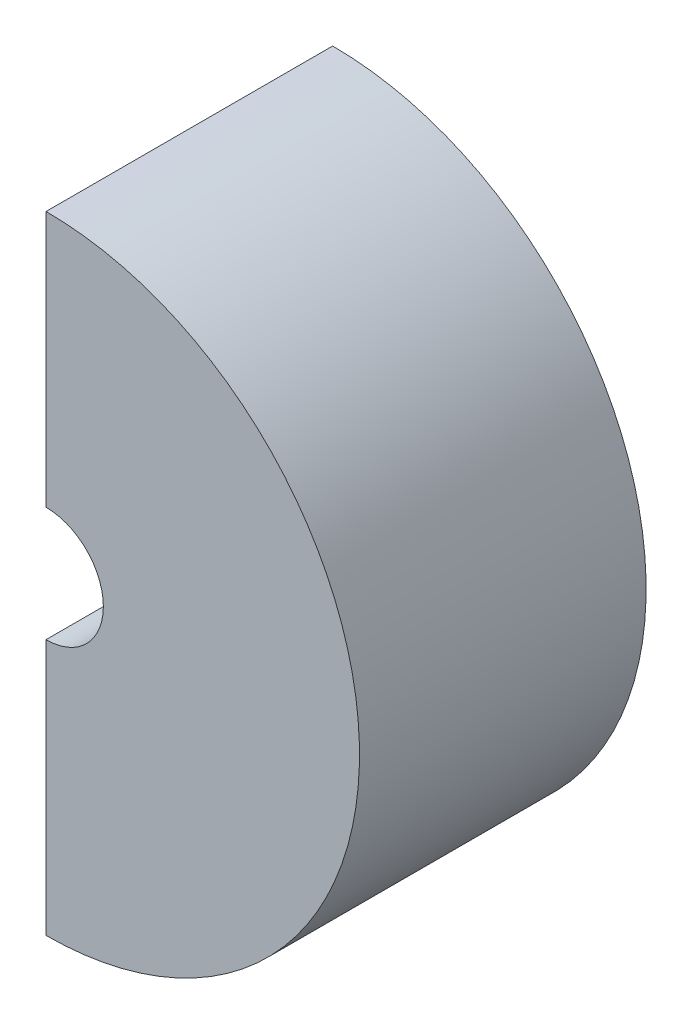
ISO-10303-21;
HEADER;
FILE_DESCRIPTION(('STEP AP214'),'2;1');
FILE_NAME('part.step','',(''),(''),'','','');
FILE_SCHEMA(('AUTOMOTIVE_DESIGN { 1 0 10303 214 1 1 1 1 }'));
ENDSEC;
DATA;
#1=APPLICATION_CONTEXT('core data for automotive mechanical design processes');
#2=APPLICATION_PROTOCOL_DEFINITION('international standard','automotive_design',2000,#1);
#3=PRODUCT_CONTEXT('',#1,'mechanical');
#4=PRODUCT('Part','Part','',(#3));
#5=PRODUCT_RELATED_PRODUCT_CATEGORY('part','',(#4));
#6=PRODUCT_DEFINITION_FORMATION('','',#4);
#7=PRODUCT_DEFINITION_CONTEXT('part definition',#1,'design');
#8=PRODUCT_DEFINITION('design','',#6,#7);
#9=PRODUCT_DEFINITION_SHAPE('','',#8);
#10=(LENGTH_UNIT() NAMED_UNIT(*) SI_UNIT(.MILLI.,.METRE.));
#11=(NAMED_UNIT(*) PLANE_ANGLE_UNIT() SI_UNIT($,.RADIAN.));
#12=(NAMED_UNIT(*) SI_UNIT($,.STERADIAN.) SOLID_ANGLE_UNIT());
#13=UNCERTAINTY_MEASURE_WITH_UNIT(LENGTH_MEASURE(1.E-05),#10,'distance_accuracy_value','');
#14=(GEOMETRIC_REPRESENTATION_CONTEXT(3) GLOBAL_UNCERTAINTY_ASSIGNED_CONTEXT((#13)) GLOBAL_UNIT_ASSIGNED_CONTEXT((#10,
#11,#12)) REPRESENTATION_CONTEXT('',''));
#15=CARTESIAN_POINT('',(0.,0.,0.));
#16=DIRECTION('',(0.,0.,1.));
#17=DIRECTION('',(1.,0.,0.));
#18=AXIS2_PLACEMENT_3D('',#15,#16,#17);
#19=CARTESIAN_POINT('',(0.,0.,0.));
#20=DIRECTION('',(1.,0.,0.));
#21=DIRECTION('',(0.,0.,-1.));
#22=AXIS2_PLACEMENT_3D('',#19,#20,#21);
#23=PLANE('',#22);
#24=DIRECTION('',(0.,1.,0.));
#25=VECTOR('',#24,1.);
#26=CARTESIAN_POINT('',(0.,0.,40.64));
#27=LINE('',#26,#25);
#28=CARTESIAN_POINT('',(0.,8.128,40.64));
#29=VERTEX_POINT('',#28);
#30=CARTESIAN_POINT('',(0.,44.45,40.64));
#31=VERTEX_POINT('',#30);
#32=EDGE_CURVE('E11',#29,#31,#27,.T.);
#33=ORIENTED_EDGE('',*,*,#32,.T.);
#34=DIRECTION('',(0.,0.,-1.));
#35=VECTOR('',#34,1.);
#36=CARTESIAN_POINT('',(0.,44.45,40.64));
#37=LINE('',#36,#35);
#38=CARTESIAN_POINT('',(0.,44.45,0.));
#39=VERTEX_POINT('',#38);
#40=EDGE_CURVE('E157',#39,#31,#37,.F.);
#41=ORIENTED_EDGE('',*,*,#40,.F.);
#42=DIRECTION('',(0.,1.,0.));
#43=VECTOR('',#42,1.);
#44=CARTESIAN_POINT('',(0.,0.,0.));
#45=LINE('',#44,#43);
#46=CARTESIAN_POINT('',(0.,8.128,0.));
#47=VERTEX_POINT('',#46);
#48=EDGE_CURVE('E153',#47,#39,#45,.T.);
#49=ORIENTED_EDGE('',*,*,#48,.F.);
#50=DIRECTION('',(0.,0.,-1.));
#51=VECTOR('',#50,1.);
#52=CARTESIAN_POINT('',(0.,8.128,40.641));
#53=LINE('',#52,#51);
#54=CARTESIAN_POINT('',(0.,8.128,8.255));
#55=VERTEX_POINT('',#54);
#56=EDGE_CURVE('E111',#55,#47,#53,.T.);
#57=ORIENTED_EDGE('',*,*,#56,.F.);
#58=DIRECTION('',(0.,-1.,0.));
#59=VECTOR('',#58,1.);
#60=CARTESIAN_POINT('',(0.,8.128,8.255));
#61=LINE('',#60,#59);
#62=CARTESIAN_POINT('',(0.,30.1117,8.255));
#63=VERTEX_POINT('',#62);
#64=EDGE_CURVE('E109',#63,#55,#61,.T.);
#65=ORIENTED_EDGE('',*,*,#64,.F.);
#66=DIRECTION('',(0.,0.,-1.));
#67=VECTOR('',#66,1.);
#68=CARTESIAN_POINT('',(0.,30.1117,8.255));
#69=LINE('',#68,#67);
#70=CARTESIAN_POINT('',(0.,30.1117,18.415));
#71=VERTEX_POINT('',#70);
#72=EDGE_CURVE('E99',#71,#63,#69,.T.);
#73=ORIENTED_EDGE('',*,*,#72,.F.);
#74=DIRECTION('',(0.,-0.9804941857777,0.196548089932528));
#75=VECTOR('',#74,1.);
#76=CARTESIAN_POINT('',(0.,0.,24.451136884307));
#77=LINE('',#76,#75);
#78=CARTESIAN_POINT('',(0.,8.128,22.8218127147766));
#79=VERTEX_POINT('',#78);
#80=EDGE_CURVE('E115',#79,#71,#77,.F.);
#81=ORIENTED_EDGE('',*,*,#80,.F.);
#82=DIRECTION('',(0.,0.,-1.));
#83=VECTOR('',#82,1.);
#84=CARTESIAN_POINT('',(0.,8.128,40.641));
#85=LINE('',#84,#83);
#86=EDGE_CURVE('E35',#29,#79,#85,.T.);
#87=ORIENTED_EDGE('',*,*,#86,.F.);
#88=EDGE_LOOP('',(#33,#41,#49,#57,#65,#73,#81,#87));
#89=FACE_BOUND('',#88,.T.);
#90=ADVANCED_FACE('F32',(#89),#23,.F.);
#91=DIRECTION('',(0.,-0.9804941857777,-0.196548089932529));
#92=VECTOR('',#91,1.);
#93=CARTESIAN_POINT('',(0.,0.,24.451136884307));
#94=LINE('',#93,#92);
#95=CARTESIAN_POINT('',(0.,-30.1117,18.415));
#96=VERTEX_POINT('',#95);
#97=CARTESIAN_POINT('',(0.,-8.128,22.8218127147766));
#98=VERTEX_POINT('',#97);
#99=EDGE_CURVE('E160',#96,#98,#94,.F.);
#100=ORIENTED_EDGE('',*,*,#99,.F.);
#101=DIRECTION('',(0.,0.,-1.));
#102=VECTOR('',#101,1.);
#103=CARTESIAN_POINT('',(0.,-30.1117,8.25499999999999));
#104=LINE('',#103,#102);
#105=CARTESIAN_POINT('',(0.,-30.1117,8.25499999999999));
#106=VERTEX_POINT('',#105);
#107=EDGE_CURVE('E106',#106,#96,#104,.F.);
#108=ORIENTED_EDGE('',*,*,#107,.F.);
#109=CARTESIAN_POINT('',(0.,-8.128,8.255));
#110=VERTEX_POINT('',#109);
#111=EDGE_CURVE('E116',#110,#106,#61,.T.);
#112=ORIENTED_EDGE('',*,*,#111,.F.);
#113=DIRECTION('',(0.,0.,-1.));
#114=VECTOR('',#113,1.);
#115=CARTESIAN_POINT('',(0.,-8.128,40.641));
#116=LINE('',#115,#114);
#117=CARTESIAN_POINT('',(0.,-8.128,0.));
#118=VERTEX_POINT('',#117);
#119=EDGE_CURVE('E151',#118,#110,#116,.F.);
#120=ORIENTED_EDGE('',*,*,#119,.F.);
#121=CARTESIAN_POINT('',(0.,-44.45,0.));
#122=VERTEX_POINT('',#121);
#123=EDGE_CURVE('E154',#122,#118,#45,.T.);
#124=ORIENTED_EDGE('',*,*,#123,.F.);
#125=DIRECTION('',(0.,0.,-1.));
#126=VECTOR('',#125,1.);
#127=CARTESIAN_POINT('',(0.,-44.45,40.64));
#128=LINE('',#127,#126);
#129=CARTESIAN_POINT('',(0.,-44.45,40.64));
#130=VERTEX_POINT('',#129);
#131=EDGE_CURVE('E158',#130,#122,#128,.T.);
#132=ORIENTED_EDGE('',*,*,#131,.F.);
#133=CARTESIAN_POINT('',(0.,-8.128,40.64));
#134=VERTEX_POINT('',#133);
#135=EDGE_CURVE('E40',#130,#134,#27,.T.);
#136=ORIENTED_EDGE('',*,*,#135,.T.);
#137=DIRECTION('',(0.,0.,-1.));
#138=VECTOR('',#137,1.);
#139=CARTESIAN_POINT('',(0.,-8.128,40.641));
#140=LINE('',#139,#138);
#141=EDGE_CURVE('E48',#98,#134,#140,.F.);
#142=ORIENTED_EDGE('',*,*,#141,.F.);
#143=EDGE_LOOP('',(#100,#108,#112,#120,#124,#132,#136,#142));
#144=FACE_BOUND('',#143,.T.);
#145=ADVANCED_FACE('F186',(#144),#23,.F.);
#146=CARTESIAN_POINT('',(19.5769583439308,-19.5769583439308,-2.54));
#147=DIRECTION('',(0.,0.,-1.));
#148=DIRECTION('',(-1.,0.,0.));
#149=AXIS2_PLACEMENT_3D('',#146,#147,#148);
#150=PLANE('',#149);
#151=CARTESIAN_POINT('',(19.5769583439308,-19.5769583439308,-2.54));
#152=DIRECTION('',(0.,0.,-1.));
#153=DIRECTION('',(-1.,0.,0.));
#154=AXIS2_PLACEMENT_3D('',#151,#152,#153);
#155=CIRCLE('',#154,3.1750000000001);
#156=CARTESIAN_POINT('',(16.4019583439306,-19.5769583439308,-2.54));
#157=VERTEX_POINT('',#156);
#158=EDGE_CURVE('E121',#157,#157,#155,.T.);
#159=ORIENTED_EDGE('',*,*,#158,.T.);
#160=EDGE_LOOP('',(#159));
#161=FACE_BOUND('',#160,.T.);
#162=ADVANCED_FACE('F188',(#161),#150,.T.);
#163=CARTESIAN_POINT('',(19.5769583439308,19.5769583439307,-2.54));
#164=DIRECTION('',(0.,0.,-1.));
#165=DIRECTION('',(-1.,0.,0.));
#166=AXIS2_PLACEMENT_3D('',#163,#164,#165);
#167=PLANE('',#166);
#168=CARTESIAN_POINT('',(19.5769583439308,19.5769583439307,-2.54));
#169=DIRECTION('',(0.,0.,-1.));
#170=DIRECTION('',(-1.,0.,0.));
#171=AXIS2_PLACEMENT_3D('',#168,#169,#170);
#172=CIRCLE('',#171,3.17500000000016);
#173=CARTESIAN_POINT('',(16.4019583439306,19.5769583439307,-2.54));
#174=VERTEX_POINT('',#173);
#175=EDGE_CURVE('E126',#174,#174,#172,.T.);
#176=ORIENTED_EDGE('',*,*,#175,.T.);
#177=EDGE_LOOP('',(#176));
#178=FACE_BOUND('',#177,.T.);
#179=ADVANCED_FACE('F193',(#178),#167,.T.);
#180=CARTESIAN_POINT('',(0.,0.,40.64));
#181=DIRECTION('',(0.,0.,-1.));
#182=DIRECTION('',(-1.,0.,0.));
#183=AXIS2_PLACEMENT_3D('',#180,#181,#182);
#184=CYLINDRICAL_SURFACE('',#183,44.45);
#185=CARTESIAN_POINT('',(0.,0.,40.64));
#186=DIRECTION('',(0.,0.,1.));
#187=DIRECTION('',(1.,0.,0.));
#188=AXIS2_PLACEMENT_3D('',#185,#186,#187);
#189=CIRCLE('',#188,44.45);
#190=EDGE_CURVE('E138',#130,#31,#189,.T.);
#191=ORIENTED_EDGE('',*,*,#190,.F.);
#192=ORIENTED_EDGE('',*,*,#131,.T.);
#193=CARTESIAN_POINT('',(0.,0.,0.));
#194=DIRECTION('',(0.,0.,1.));
#195=DIRECTION('',(1.,0.,0.));
#196=AXIS2_PLACEMENT_3D('',#193,#194,#195);
#197=CIRCLE('',#196,44.45);
#198=EDGE_CURVE('E133',#122,#39,#197,.T.);
#199=ORIENTED_EDGE('',*,*,#198,.T.);
#200=ORIENTED_EDGE('',*,*,#40,.T.);
#201=EDGE_LOOP('',(#191,#192,#199,#200));
#202=FACE_BOUND('',#201,.T.);
#203=ADVANCED_FACE('F178',(#202),#184,.T.);
#204=CARTESIAN_POINT('',(19.5769583439308,-19.5769583439308,-2.54));
#205=DIRECTION('',(0.,0.,1.));
#206=DIRECTION('',(1.,0.,0.));
#207=AXIS2_PLACEMENT_3D('',#204,#205,#206);
#208=CYLINDRICAL_SURFACE('',#207,3.1750000000001);
#209=ORIENTED_EDGE('',*,*,#158,.F.);
#210=EDGE_LOOP('',(#209));
#211=FACE_BOUND('',#210,.T.);
#212=CARTESIAN_POINT('',(19.5769583439308,-19.5769583439308,0.));
#213=DIRECTION('',(0.,0.,1.));
#214=DIRECTION('',(1.,0.,0.));
#215=AXIS2_PLACEMENT_3D('',#212,#213,#214);
#216=CIRCLE('',#215,3.1750000000001);
#217=CARTESIAN_POINT('',(22.7519583439309,-19.5769583439308,0.));
#218=VERTEX_POINT('',#217);
#219=EDGE_CURVE('E141',#218,#218,#216,.F.);
#220=ORIENTED_EDGE('',*,*,#219,.T.);
#221=EDGE_LOOP('',(#220));
#222=FACE_BOUND('',#221,.T.);
#223=ADVANCED_FACE('F209',(#211,#222),#208,.T.);
#224=CARTESIAN_POINT('',(19.5769583439308,19.5769583439307,-2.54));
#225=DIRECTION('',(0.,0.,1.));
#226=DIRECTION('',(1.,0.,0.));
#227=AXIS2_PLACEMENT_3D('',#224,#225,#226);
#228=CYLINDRICAL_SURFACE('',#227,3.17500000000016);
#229=ORIENTED_EDGE('',*,*,#175,.F.);
#230=EDGE_LOOP('',(#229));
#231=FACE_BOUND('',#230,.T.);
#232=CARTESIAN_POINT('',(19.5769583439308,19.5769583439307,0.));
#233=DIRECTION('',(0.,0.,1.));
#234=DIRECTION('',(1.,0.,0.));
#235=AXIS2_PLACEMENT_3D('',#232,#233,#234);
#236=CIRCLE('',#235,3.17500000000016);
#237=CARTESIAN_POINT('',(22.7519583439309,19.5769583439307,0.));
#238=VERTEX_POINT('',#237);
#239=EDGE_CURVE('E148',#238,#238,#236,.F.);
#240=ORIENTED_EDGE('',*,*,#239,.T.);
#241=EDGE_LOOP('',(#240));
#242=FACE_BOUND('',#241,.T.);
#243=ADVANCED_FACE('F206',(#231,#242),#228,.T.);
#244=CARTESIAN_POINT('',(0.,0.,0.));
#245=DIRECTION('',(0.,0.,1.));
#246=DIRECTION('',(1.,0.,0.));
#247=AXIS2_PLACEMENT_3D('',#244,#245,#246);
#248=PLANE('',#247);
#249=ORIENTED_EDGE('',*,*,#239,.F.);
#250=EDGE_LOOP('',(#249));
#251=FACE_BOUND('',#250,.T.);
#252=ORIENTED_EDGE('',*,*,#219,.F.);
#253=EDGE_LOOP('',(#252));
#254=FACE_BOUND('',#253,.T.);
#255=ORIENTED_EDGE('',*,*,#198,.F.);
#256=ORIENTED_EDGE('',*,*,#123,.T.);
#257=CARTESIAN_POINT('',(0.,0.,0.));
#258=DIRECTION('',(0.,0.,-1.));
#259=DIRECTION('',(-1.,0.,0.));
#260=AXIS2_PLACEMENT_3D('',#257,#258,#259);
#261=CIRCLE('',#260,8.128);
#262=EDGE_CURVE('E130',#47,#118,#261,.T.);
#263=ORIENTED_EDGE('',*,*,#262,.F.);
#264=ORIENTED_EDGE('',*,*,#48,.T.);
#265=EDGE_LOOP('',(#255,#256,#263,#264));
#266=FACE_BOUND('',#265,.T.);
#267=ADVANCED_FACE('F181',(#251,#254,#266),#248,.F.);
#268=CARTESIAN_POINT('',(0.,0.,40.641));
#269=DIRECTION('',(0.,0.,-1.));
#270=DIRECTION('',(-1.,0.,0.));
#271=AXIS2_PLACEMENT_3D('',#268,#269,#270);
#272=CYLINDRICAL_SURFACE('',#271,8.128);
#273=CARTESIAN_POINT('',(0.,0.,22.8218127147766));
#274=DIRECTION('',(0.,0.,-1.));
#275=DIRECTION('',(0.,1.,0.));
#276=AXIS2_PLACEMENT_3D('',#273,#274,#275);
#277=CIRCLE('',#276,8.128);
#278=EDGE_CURVE('E137',#79,#98,#277,.T.);
#279=ORIENTED_EDGE('',*,*,#278,.T.);
#280=ORIENTED_EDGE('',*,*,#141,.T.);
#281=CARTESIAN_POINT('',(0.,0.,40.64));
#282=DIRECTION('',(0.,0.,1.));
#283=DIRECTION('',(1.,0.,0.));
#284=AXIS2_PLACEMENT_3D('',#281,#282,#283);
#285=CIRCLE('',#284,8.128);
#286=EDGE_CURVE('E134',#29,#134,#285,.F.);
#287=ORIENTED_EDGE('',*,*,#286,.F.);
#288=ORIENTED_EDGE('',*,*,#86,.T.);
#289=EDGE_LOOP('',(#279,#280,#287,#288));
#290=FACE_BOUND('',#289,.T.);
#291=ADVANCED_FACE('F169',(#290),#272,.F.);
#292=ORIENTED_EDGE('',*,*,#262,.T.);
#293=ORIENTED_EDGE('',*,*,#119,.T.);
#294=CARTESIAN_POINT('',(0.,0.,8.255));
#295=DIRECTION('',(0.,0.,-1.));
#296=DIRECTION('',(0.,1.,0.));
#297=AXIS2_PLACEMENT_3D('',#294,#295,#296);
#298=CIRCLE('',#297,8.128);
#299=EDGE_CURVE('E123',#110,#55,#298,.F.);
#300=ORIENTED_EDGE('',*,*,#299,.T.);
#301=ORIENTED_EDGE('',*,*,#56,.T.);
#302=EDGE_LOOP('',(#292,#293,#300,#301));
#303=FACE_BOUND('',#302,.T.);
#304=ADVANCED_FACE('F184',(#303),#272,.F.);
#305=CARTESIAN_POINT('',(0.,0.,8.255));
#306=DIRECTION('',(0.,0.,-1.));
#307=DIRECTION('',(0.,1.,0.));
#308=AXIS2_PLACEMENT_3D('',#305,#306,#307);
#309=CYLINDRICAL_SURFACE('',#308,30.1117);
#310=CARTESIAN_POINT('',(0.,0.,8.255));
#311=DIRECTION('',(0.,0.,-1.));
#312=DIRECTION('',(0.,1.,0.));
#313=AXIS2_PLACEMENT_3D('',#310,#311,#312);
#314=CIRCLE('',#313,30.1117);
#315=EDGE_CURVE('E103',#63,#106,#314,.T.);
#316=ORIENTED_EDGE('',*,*,#315,.T.);
#317=ORIENTED_EDGE('',*,*,#107,.T.);
#318=CARTESIAN_POINT('',(0.,0.,18.415));
#319=DIRECTION('',(0.,0.,-1.));
#320=DIRECTION('',(0.,1.,0.));
#321=AXIS2_PLACEMENT_3D('',#318,#319,#320);
#322=CIRCLE('',#321,30.1117);
#323=EDGE_CURVE('E105',#71,#96,#322,.T.);
#324=ORIENTED_EDGE('',*,*,#323,.F.);
#325=ORIENTED_EDGE('',*,*,#72,.T.);
#326=EDGE_LOOP('',(#316,#317,#324,#325));
#327=FACE_BOUND('',#326,.T.);
#328=ADVANCED_FACE('F101',(#327),#309,.F.);
#329=CARTESIAN_POINT('',(0.,8.128,8.255));
#330=DIRECTION('',(0.,0.,-1.));
#331=DIRECTION('',(0.,1.,0.));
#332=AXIS2_PLACEMENT_3D('',#329,#330,#331);
#333=PLANE('',#332);
#334=ORIENTED_EDGE('',*,*,#315,.F.);
#335=ORIENTED_EDGE('',*,*,#64,.T.);
#336=ORIENTED_EDGE('',*,*,#299,.F.);
#337=ORIENTED_EDGE('',*,*,#111,.T.);
#338=EDGE_LOOP('',(#334,#335,#336,#337));
#339=FACE_BOUND('',#338,.T.);
#340=ADVANCED_FACE('F118',(#339),#333,.F.);
#341=CARTESIAN_POINT('',(0.,0.,18.415));
#342=DIRECTION('',(0.,0.,-1.));
#343=DIRECTION('',(0.,1.,0.));
#344=AXIS2_PLACEMENT_3D('',#341,#342,#343);
#345=CONICAL_SURFACE('',#344,30.1117,1.37296023833915);
#346=ORIENTED_EDGE('',*,*,#323,.T.);
#347=ORIENTED_EDGE('',*,*,#99,.T.);
#348=ORIENTED_EDGE('',*,*,#278,.F.);
#349=ORIENTED_EDGE('',*,*,#80,.T.);
#350=EDGE_LOOP('',(#346,#347,#348,#349));
#351=FACE_BOUND('',#350,.T.);
#352=ADVANCED_FACE('F167',(#351),#345,.F.);
#353=CARTESIAN_POINT('',(0.,0.,40.64));
#354=DIRECTION('',(0.,0.,1.));
#355=DIRECTION('',(1.,0.,0.));
#356=AXIS2_PLACEMENT_3D('',#353,#354,#355);
#357=PLANE('',#356);
#358=ORIENTED_EDGE('',*,*,#135,.F.);
#359=ORIENTED_EDGE('',*,*,#190,.T.);
#360=ORIENTED_EDGE('',*,*,#32,.F.);
#361=ORIENTED_EDGE('',*,*,#286,.T.);
#362=EDGE_LOOP('',(#358,#359,#360,#361));
#363=FACE_BOUND('',#362,.T.);
#364=ADVANCED_FACE('F171',(#363),#357,.T.);
#365=CLOSED_SHELL('',(#90,#145,#162,#179,#203,#223,#243,#267,#291,#304,#328,#340,#352,#364));
#366=MANIFOLD_SOLID_BREP('B2',#365);
#367=ADVANCED_BREP_SHAPE_REPRESENTATION('',(#18,#366),#14);
#368=SHAPE_DEFINITION_REPRESENTATION(#9,#367);
ENDSEC;
END-ISO-10303-21;
